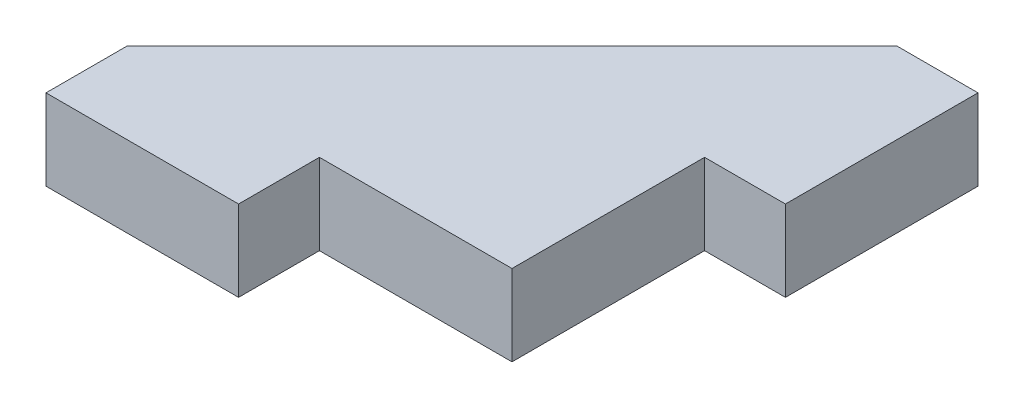
ISO-10303-21;
HEADER;
FILE_DESCRIPTION(('STEP AP214'),'2;1');
FILE_NAME('part.step','',(''),(''),'','','');
FILE_SCHEMA(('AUTOMOTIVE_DESIGN { 1 0 10303 214 1 1 1 1 }'));
ENDSEC;
DATA;
#1=APPLICATION_CONTEXT('core data for automotive mechanical design processes');
#2=APPLICATION_PROTOCOL_DEFINITION('international standard','automotive_design',2000,#1);
#3=PRODUCT_CONTEXT('',#1,'mechanical');
#4=PRODUCT('Part','Part','',(#3));
#5=PRODUCT_RELATED_PRODUCT_CATEGORY('part','',(#4));
#6=PRODUCT_DEFINITION_FORMATION('','',#4);
#7=PRODUCT_DEFINITION_CONTEXT('part definition',#1,'design');
#8=PRODUCT_DEFINITION('design','',#6,#7);
#9=PRODUCT_DEFINITION_SHAPE('','',#8);
#10=(LENGTH_UNIT() NAMED_UNIT(*) SI_UNIT(.MILLI.,.METRE.));
#11=(NAMED_UNIT(*) PLANE_ANGLE_UNIT() SI_UNIT($,.RADIAN.));
#12=(NAMED_UNIT(*) SI_UNIT($,.STERADIAN.) SOLID_ANGLE_UNIT());
#13=UNCERTAINTY_MEASURE_WITH_UNIT(LENGTH_MEASURE(1.E-05),#10,'distance_accuracy_value','');
#14=(GEOMETRIC_REPRESENTATION_CONTEXT(3) GLOBAL_UNCERTAINTY_ASSIGNED_CONTEXT((#13)) GLOBAL_UNIT_ASSIGNED_CONTEXT((#10,
#11,#12)) REPRESENTATION_CONTEXT('',''));
#15=CARTESIAN_POINT('',(0.,0.,0.));
#16=DIRECTION('',(0.,0.,1.));
#17=DIRECTION('',(1.,0.,0.));
#18=AXIS2_PLACEMENT_3D('',#15,#16,#17);
#19=CARTESIAN_POINT('',(-8.36198543722724,5.334,0.));
#20=DIRECTION('',(1.,0.,0.));
#21=DIRECTION('',(0.,0.,-1.));
#22=AXIS2_PLACEMENT_3D('',#19,#20,#21);
#23=PLANE('',#22);
#24=DIRECTION('',(0.,0.,1.));
#25=VECTOR('',#24,1.);
#26=CARTESIAN_POINT('',(-8.36198543722724,0.,0.));
#27=LINE('',#26,#25);
#28=CARTESIAN_POINT('',(-8.36198543722724,0.,13.62211422302));
#29=VERTEX_POINT('',#28);
#30=CARTESIAN_POINT('',(-8.36198543722724,0.,18.95611422302));
#31=VERTEX_POINT('',#30);
#32=EDGE_CURVE('E138',#29,#31,#27,.T.);
#33=ORIENTED_EDGE('',*,*,#32,.F.);
#34=DIRECTION('',(0.,-1.,0.));
#35=VECTOR('',#34,1.);
#36=CARTESIAN_POINT('',(-8.36198543722724,5.334,13.62211422302));
#37=LINE('',#36,#35);
#38=CARTESIAN_POINT('',(-8.36198543722724,5.334,13.62211422302));
#39=VERTEX_POINT('',#38);
#40=EDGE_CURVE('E11',#39,#29,#37,.T.);
#41=ORIENTED_EDGE('',*,*,#40,.F.);
#42=DIRECTION('',(0.,0.,1.));
#43=VECTOR('',#42,1.);
#44=CARTESIAN_POINT('',(-8.36198543722724,5.334,0.));
#45=LINE('',#44,#43);
#46=CARTESIAN_POINT('',(-8.36198543722724,5.334,18.95611422302));
#47=VERTEX_POINT('',#46);
#48=EDGE_CURVE('E160',#39,#47,#45,.T.);
#49=ORIENTED_EDGE('',*,*,#48,.T.);
#50=DIRECTION('',(0.,-1.,0.));
#51=VECTOR('',#50,1.);
#52=CARTESIAN_POINT('',(-8.36198543722724,5.334,18.95611422302));
#53=LINE('',#52,#51);
#54=EDGE_CURVE('E90',#47,#31,#53,.T.);
#55=ORIENTED_EDGE('',*,*,#54,.T.);
#56=EDGE_LOOP('',(#33,#41,#49,#55));
#57=FACE_BOUND('',#56,.T.);
#58=ADVANCED_FACE('F37',(#57),#23,.T.);
#59=CARTESIAN_POINT('',(0.,5.334,13.62211422302));
#60=DIRECTION('',(0.,0.,-1.));
#61=DIRECTION('',(-1.,0.,0.));
#62=AXIS2_PLACEMENT_3D('',#59,#60,#61);
#63=PLANE('',#62);
#64=DIRECTION('',(1.,0.,0.));
#65=VECTOR('',#64,1.);
#66=CARTESIAN_POINT('',(0.,0.,13.62211422302));
#67=LINE('',#66,#65);
#68=CARTESIAN_POINT('',(4.33801456277276,0.,13.62211422302));
#69=VERTEX_POINT('',#68);
#70=EDGE_CURVE('E141',#29,#69,#67,.T.);
#71=ORIENTED_EDGE('',*,*,#70,.T.);
#72=DIRECTION('',(0.,-1.,0.));
#73=VECTOR('',#72,1.);
#74=CARTESIAN_POINT('',(4.33801456277276,5.334,13.62211422302));
#75=LINE('',#74,#73);
#76=CARTESIAN_POINT('',(4.33801456277276,5.334,13.62211422302));
#77=VERTEX_POINT('',#76);
#78=EDGE_CURVE('E45',#77,#69,#75,.T.);
#79=ORIENTED_EDGE('',*,*,#78,.F.);
#80=DIRECTION('',(1.,0.,0.));
#81=VECTOR('',#80,1.);
#82=CARTESIAN_POINT('',(0.,5.334,13.62211422302));
#83=LINE('',#82,#81);
#84=EDGE_CURVE('E190',#39,#77,#83,.T.);
#85=ORIENTED_EDGE('',*,*,#84,.F.);
#86=ORIENTED_EDGE('',*,*,#40,.T.);
#87=EDGE_LOOP('',(#71,#79,#85,#86));
#88=FACE_BOUND('',#87,.T.);
#89=ADVANCED_FACE('F178',(#88),#63,.F.);
#90=CARTESIAN_POINT('',(4.33801456277275,5.334,0.));
#91=DIRECTION('',(1.,0.,0.));
#92=DIRECTION('',(0.,0.,-1.));
#93=AXIS2_PLACEMENT_3D('',#90,#91,#92);
#94=PLANE('',#93);
#95=DIRECTION('',(0.,0.,1.));
#96=VECTOR('',#95,1.);
#97=CARTESIAN_POINT('',(4.33801456277275,0.,0.));
#98=LINE('',#97,#96);
#99=CARTESIAN_POINT('',(4.33801456277275,0.,0.922114223020031));
#100=VERTEX_POINT('',#99);
#101=EDGE_CURVE('E144',#100,#69,#98,.T.);
#102=ORIENTED_EDGE('',*,*,#101,.F.);
#103=DIRECTION('',(0.,-1.,0.));
#104=VECTOR('',#103,1.);
#105=CARTESIAN_POINT('',(4.33801456277275,5.334,0.922114223020031));
#106=LINE('',#105,#104);
#107=CARTESIAN_POINT('',(4.33801456277275,5.334,0.922114223020031));
#108=VERTEX_POINT('',#107);
#109=EDGE_CURVE('E168',#108,#100,#106,.T.);
#110=ORIENTED_EDGE('',*,*,#109,.F.);
#111=DIRECTION('',(0.,0.,1.));
#112=VECTOR('',#111,1.);
#113=CARTESIAN_POINT('',(4.33801456277275,5.334,0.));
#114=LINE('',#113,#112);
#115=EDGE_CURVE('E175',#108,#77,#114,.T.);
#116=ORIENTED_EDGE('',*,*,#115,.T.);
#117=ORIENTED_EDGE('',*,*,#78,.T.);
#118=EDGE_LOOP('',(#102,#110,#116,#117));
#119=FACE_BOUND('',#118,.T.);
#120=ADVANCED_FACE('F173',(#119),#94,.T.);
#121=CARTESIAN_POINT('',(0.,5.334,0.922114223020031));
#122=DIRECTION('',(0.,0.,-1.));
#123=DIRECTION('',(-1.,0.,0.));
#124=AXIS2_PLACEMENT_3D('',#121,#122,#123);
#125=PLANE('',#124);
#126=DIRECTION('',(1.,0.,0.));
#127=VECTOR('',#126,1.);
#128=CARTESIAN_POINT('',(0.,0.,0.922114223020031));
#129=LINE('',#128,#127);
#130=CARTESIAN_POINT('',(9.67201456277276,0.,0.922114223020031));
#131=VERTEX_POINT('',#130);
#132=EDGE_CURVE('E147',#100,#131,#129,.T.);
#133=ORIENTED_EDGE('',*,*,#132,.T.);
#134=DIRECTION('',(0.,-1.,0.));
#135=VECTOR('',#134,1.);
#136=CARTESIAN_POINT('',(9.67201456277276,5.334,0.922114223020031));
#137=LINE('',#136,#135);
#138=CARTESIAN_POINT('',(9.67201456277276,5.334,0.922114223020031));
#139=VERTEX_POINT('',#138);
#140=EDGE_CURVE('E166',#139,#131,#137,.T.);
#141=ORIENTED_EDGE('',*,*,#140,.F.);
#142=DIRECTION('',(1.,0.,0.));
#143=VECTOR('',#142,1.);
#144=CARTESIAN_POINT('',(0.,5.334,0.922114223020031));
#145=LINE('',#144,#143);
#146=EDGE_CURVE('E188',#108,#139,#145,.T.);
#147=ORIENTED_EDGE('',*,*,#146,.F.);
#148=ORIENTED_EDGE('',*,*,#109,.T.);
#149=EDGE_LOOP('',(#133,#141,#147,#148));
#150=FACE_BOUND('',#149,.T.);
#151=ADVANCED_FACE('F185',(#150),#125,.F.);
#152=CARTESIAN_POINT('',(9.67201456277276,5.334,0.));
#153=DIRECTION('',(1.,0.,0.));
#154=DIRECTION('',(0.,0.,-1.));
#155=AXIS2_PLACEMENT_3D('',#152,#153,#154);
#156=PLANE('',#155);
#157=DIRECTION('',(0.,0.,1.));
#158=VECTOR('',#157,1.);
#159=CARTESIAN_POINT('',(9.67201456277276,0.,0.));
#160=LINE('',#159,#158);
#161=CARTESIAN_POINT('',(9.67201456277275,0.,-11.77788577698));
#162=VERTEX_POINT('',#161);
#163=EDGE_CURVE('E150',#162,#131,#160,.T.);
#164=ORIENTED_EDGE('',*,*,#163,.F.);
#165=DIRECTION('',(0.,-1.,0.));
#166=VECTOR('',#165,1.);
#167=CARTESIAN_POINT('',(9.67201456277275,5.334,-11.77788577698));
#168=LINE('',#167,#166);
#169=CARTESIAN_POINT('',(9.67201456277275,5.334,-11.77788577698));
#170=VERTEX_POINT('',#169);
#171=EDGE_CURVE('E164',#170,#162,#168,.T.);
#172=ORIENTED_EDGE('',*,*,#171,.F.);
#173=DIRECTION('',(0.,0.,1.));
#174=VECTOR('',#173,1.);
#175=CARTESIAN_POINT('',(9.67201456277276,5.334,0.));
#176=LINE('',#175,#174);
#177=EDGE_CURVE('E133',#170,#139,#176,.T.);
#178=ORIENTED_EDGE('',*,*,#177,.T.);
#179=ORIENTED_EDGE('',*,*,#140,.T.);
#180=EDGE_LOOP('',(#164,#172,#178,#179));
#181=FACE_BOUND('',#180,.T.);
#182=ADVANCED_FACE('F195',(#181),#156,.T.);
#183=CARTESIAN_POINT('',(0.,5.334,-11.77788577698));
#184=DIRECTION('',(0.,0.,-1.));
#185=DIRECTION('',(-1.,0.,0.));
#186=AXIS2_PLACEMENT_3D('',#183,#184,#185);
#187=PLANE('',#186);
#188=DIRECTION('',(1.,0.,0.));
#189=VECTOR('',#188,1.);
#190=CARTESIAN_POINT('',(0.,0.,-11.77788577698));
#191=LINE('',#190,#189);
#192=CARTESIAN_POINT('',(4.33801456277275,0.,-11.77788577698));
#193=VERTEX_POINT('',#192);
#194=EDGE_CURVE('E153',#193,#162,#191,.T.);
#195=ORIENTED_EDGE('',*,*,#194,.F.);
#196=DIRECTION('',(0.,-1.,0.));
#197=VECTOR('',#196,1.);
#198=CARTESIAN_POINT('',(4.33801456277275,5.334,-11.77788577698));
#199=LINE('',#198,#197);
#200=CARTESIAN_POINT('',(4.33801456277275,5.334,-11.77788577698));
#201=VERTEX_POINT('',#200);
#202=EDGE_CURVE('E121',#201,#193,#199,.T.);
#203=ORIENTED_EDGE('',*,*,#202,.F.);
#204=DIRECTION('',(1.,0.,0.));
#205=VECTOR('',#204,1.);
#206=CARTESIAN_POINT('',(0.,5.334,-11.77788577698));
#207=LINE('',#206,#205);
#208=EDGE_CURVE('E131',#201,#170,#207,.T.);
#209=ORIENTED_EDGE('',*,*,#208,.T.);
#210=ORIENTED_EDGE('',*,*,#171,.T.);
#211=EDGE_LOOP('',(#195,#203,#209,#210));
#212=FACE_BOUND('',#211,.T.);
#213=ADVANCED_FACE('F198',(#212),#187,.T.);
#214=CARTESIAN_POINT('',(-3.71993560710361,5.334,-3.71993560710361));
#215=DIRECTION('',(-0.707106781186548,0.,-0.707106781186548));
#216=DIRECTION('',(-0.707106781186547,0.,0.707106781186548));
#217=AXIS2_PLACEMENT_3D('',#214,#215,#216);
#218=PLANE('',#217);
#219=DIRECTION('',(0.707106781186547,0.,-0.707106781186548));
#220=VECTOR('',#219,1.);
#221=CARTESIAN_POINT('',(-3.71993560710361,0.,-3.71993560710361));
#222=LINE('',#221,#220);
#223=CARTESIAN_POINT('',(-21.0619854372272,0.,13.62211422302));
#224=VERTEX_POINT('',#223);
#225=EDGE_CURVE('E120',#224,#193,#222,.T.);
#226=ORIENTED_EDGE('',*,*,#225,.F.);
#227=DIRECTION('',(0.,-1.,0.));
#228=VECTOR('',#227,1.);
#229=CARTESIAN_POINT('',(-21.0619854372272,5.334,13.62211422302));
#230=LINE('',#229,#228);
#231=CARTESIAN_POINT('',(-21.0619854372272,5.334,13.62211422302));
#232=VERTEX_POINT('',#231);
#233=EDGE_CURVE('E114',#232,#224,#230,.T.);
#234=ORIENTED_EDGE('',*,*,#233,.F.);
#235=DIRECTION('',(0.707106781186547,0.,-0.707106781186548));
#236=VECTOR('',#235,1.);
#237=CARTESIAN_POINT('',(-3.71993560710361,5.334,-3.71993560710361));
#238=LINE('',#237,#236);
#239=EDGE_CURVE('E118',#232,#201,#238,.T.);
#240=ORIENTED_EDGE('',*,*,#239,.T.);
#241=ORIENTED_EDGE('',*,*,#202,.T.);
#242=EDGE_LOOP('',(#226,#234,#240,#241));
#243=FACE_BOUND('',#242,.T.);
#244=ADVANCED_FACE('F116',(#243),#218,.T.);
#245=CARTESIAN_POINT('',(-21.0619854372272,5.334,0.));
#246=DIRECTION('',(1.,0.,0.));
#247=DIRECTION('',(0.,0.,-1.));
#248=AXIS2_PLACEMENT_3D('',#245,#246,#247);
#249=PLANE('',#248);
#250=DIRECTION('',(0.,0.,1.));
#251=VECTOR('',#250,1.);
#252=CARTESIAN_POINT('',(-21.0619854372272,0.,0.));
#253=LINE('',#252,#251);
#254=CARTESIAN_POINT('',(-21.0619854372272,0.,18.95611422302));
#255=VERTEX_POINT('',#254);
#256=EDGE_CURVE('E83',#224,#255,#253,.T.);
#257=ORIENTED_EDGE('',*,*,#256,.T.);
#258=DIRECTION('',(0.,-1.,0.));
#259=VECTOR('',#258,1.);
#260=CARTESIAN_POINT('',(-21.0619854372272,5.334,18.95611422302));
#261=LINE('',#260,#259);
#262=CARTESIAN_POINT('',(-21.0619854372272,5.334,18.95611422302));
#263=VERTEX_POINT('',#262);
#264=EDGE_CURVE('E122',#263,#255,#261,.T.);
#265=ORIENTED_EDGE('',*,*,#264,.F.);
#266=DIRECTION('',(0.,0.,1.));
#267=VECTOR('',#266,1.);
#268=CARTESIAN_POINT('',(-21.0619854372272,5.334,0.));
#269=LINE('',#268,#267);
#270=EDGE_CURVE('E124',#232,#263,#269,.T.);
#271=ORIENTED_EDGE('',*,*,#270,.F.);
#272=ORIENTED_EDGE('',*,*,#233,.T.);
#273=EDGE_LOOP('',(#257,#265,#271,#272));
#274=FACE_BOUND('',#273,.T.);
#275=ADVANCED_FACE('F125',(#274),#249,.F.);
#276=CARTESIAN_POINT('',(0.,5.334,18.95611422302));
#277=DIRECTION('',(0.,0.,-1.));
#278=DIRECTION('',(-1.,0.,0.));
#279=AXIS2_PLACEMENT_3D('',#276,#277,#278);
#280=PLANE('',#279);
#281=DIRECTION('',(1.,0.,0.));
#282=VECTOR('',#281,1.);
#283=CARTESIAN_POINT('',(0.,0.,18.95611422302));
#284=LINE('',#283,#282);
#285=EDGE_CURVE('E158',#255,#31,#284,.T.);
#286=ORIENTED_EDGE('',*,*,#285,.T.);
#287=ORIENTED_EDGE('',*,*,#54,.F.);
#288=DIRECTION('',(1.,0.,0.));
#289=VECTOR('',#288,1.);
#290=CARTESIAN_POINT('',(0.,5.334,18.95611422302));
#291=LINE('',#290,#289);
#292=EDGE_CURVE('E53',#263,#47,#291,.T.);
#293=ORIENTED_EDGE('',*,*,#292,.F.);
#294=ORIENTED_EDGE('',*,*,#264,.T.);
#295=EDGE_LOOP('',(#286,#287,#293,#294));
#296=FACE_BOUND('',#295,.T.);
#297=ADVANCED_FACE('F201',(#296),#280,.F.);
#298=CARTESIAN_POINT('',(0.,5.334,0.));
#299=DIRECTION('',(0.,1.,0.));
#300=DIRECTION('',(0.,0.,1.));
#301=AXIS2_PLACEMENT_3D('',#298,#299,#300);
#302=PLANE('',#301);
#303=ORIENTED_EDGE('',*,*,#48,.F.);
#304=ORIENTED_EDGE('',*,*,#84,.T.);
#305=ORIENTED_EDGE('',*,*,#115,.F.);
#306=ORIENTED_EDGE('',*,*,#146,.T.);
#307=ORIENTED_EDGE('',*,*,#177,.F.);
#308=ORIENTED_EDGE('',*,*,#208,.F.);
#309=ORIENTED_EDGE('',*,*,#239,.F.);
#310=ORIENTED_EDGE('',*,*,#270,.T.);
#311=ORIENTED_EDGE('',*,*,#292,.T.);
#312=EDGE_LOOP('',(#303,#304,#305,#306,#307,#308,#309,#310,#311));
#313=FACE_BOUND('',#312,.T.);
#314=ADVANCED_FACE('F128',(#313),#302,.T.);
#315=CARTESIAN_POINT('',(0.,0.,0.));
#316=DIRECTION('',(0.,1.,0.));
#317=DIRECTION('',(0.,0.,1.));
#318=AXIS2_PLACEMENT_3D('',#315,#316,#317);
#319=PLANE('',#318);
#320=ORIENTED_EDGE('',*,*,#32,.T.);
#321=ORIENTED_EDGE('',*,*,#285,.F.);
#322=ORIENTED_EDGE('',*,*,#256,.F.);
#323=ORIENTED_EDGE('',*,*,#225,.T.);
#324=ORIENTED_EDGE('',*,*,#194,.T.);
#325=ORIENTED_EDGE('',*,*,#163,.T.);
#326=ORIENTED_EDGE('',*,*,#132,.F.);
#327=ORIENTED_EDGE('',*,*,#101,.T.);
#328=ORIENTED_EDGE('',*,*,#70,.F.);
#329=EDGE_LOOP('',(#320,#321,#322,#323,#324,#325,#326,#327,#328));
#330=FACE_BOUND('',#329,.T.);
#331=ADVANCED_FACE('F181',(#330),#319,.F.);
#332=CLOSED_SHELL('',(#58,#89,#120,#151,#182,#213,#244,#275,#297,#314,#331));
#333=MANIFOLD_SOLID_BREP('B2',#332);
#334=ADVANCED_BREP_SHAPE_REPRESENTATION('',(#18,#333),#14);
#335=SHAPE_DEFINITION_REPRESENTATION(#9,#334);
ENDSEC;
END-ISO-10303-21;
